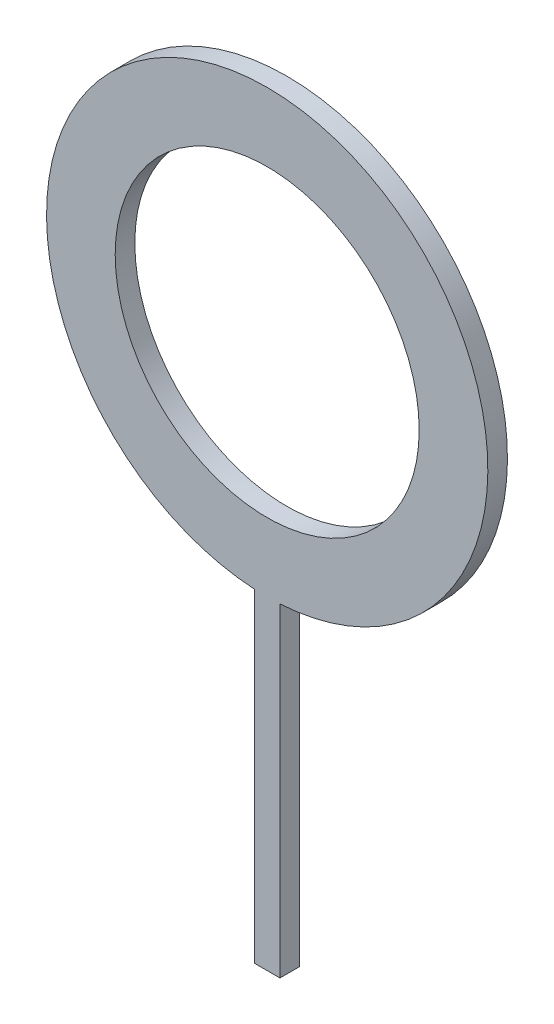
ISO-10303-21;
HEADER;
FILE_DESCRIPTION(('STEP AP214'),'2;1');
FILE_NAME('part.step','',(''),(''),'','','');
FILE_SCHEMA(('AUTOMOTIVE_DESIGN { 1 0 10303 214 1 1 1 1 }'));
ENDSEC;
DATA;
#1=APPLICATION_CONTEXT('core data for automotive mechanical design processes');
#2=APPLICATION_PROTOCOL_DEFINITION('international standard','automotive_design',2000,#1);
#3=PRODUCT_CONTEXT('',#1,'mechanical');
#4=PRODUCT('Part','Part','',(#3));
#5=PRODUCT_RELATED_PRODUCT_CATEGORY('part','',(#4));
#6=PRODUCT_DEFINITION_FORMATION('','',#4);
#7=PRODUCT_DEFINITION_CONTEXT('part definition',#1,'design');
#8=PRODUCT_DEFINITION('design','',#6,#7);
#9=PRODUCT_DEFINITION_SHAPE('','',#8);
#10=(LENGTH_UNIT() NAMED_UNIT(*) SI_UNIT(.MILLI.,.METRE.));
#11=(NAMED_UNIT(*) PLANE_ANGLE_UNIT() SI_UNIT($,.RADIAN.));
#12=(NAMED_UNIT(*) SI_UNIT($,.STERADIAN.) SOLID_ANGLE_UNIT());
#13=UNCERTAINTY_MEASURE_WITH_UNIT(LENGTH_MEASURE(1.E-05),#10,'distance_accuracy_value','');
#14=(GEOMETRIC_REPRESENTATION_CONTEXT(3) GLOBAL_UNCERTAINTY_ASSIGNED_CONTEXT((#13)) GLOBAL_UNIT_ASSIGNED_CONTEXT((#10,
#11,#12)) REPRESENTATION_CONTEXT('',''));
#15=CARTESIAN_POINT('',(0.,0.,0.));
#16=DIRECTION('',(0.,0.,1.));
#17=DIRECTION('',(1.,0.,0.));
#18=AXIS2_PLACEMENT_3D('',#15,#16,#17);
#19=CARTESIAN_POINT('',(0.,-27.75,1.));
#20=DIRECTION('',(0.,1.,0.));
#21=DIRECTION('',(0.,0.,1.));
#22=AXIS2_PLACEMENT_3D('',#19,#20,#21);
#23=PLANE('',#22);
#24=DIRECTION('',(1.,0.,0.));
#25=VECTOR('',#24,1.);
#26=CARTESIAN_POINT('',(0.,-27.75,0.));
#27=LINE('',#26,#25);
#28=CARTESIAN_POINT('',(-0.65,-27.75,0.));
#29=VERTEX_POINT('',#28);
#30=CARTESIAN_POINT('',(0.65,-27.75,0.));
#31=VERTEX_POINT('',#30);
#32=EDGE_CURVE('E102',#29,#31,#27,.T.);
#33=ORIENTED_EDGE('',*,*,#32,.T.);
#34=DIRECTION('',(0.,0.,-1.));
#35=VECTOR('',#34,1.);
#36=CARTESIAN_POINT('',(0.65,-27.75,1.));
#37=LINE('',#36,#35);
#38=CARTESIAN_POINT('',(0.65,-27.75,1.));
#39=VERTEX_POINT('',#38);
#40=EDGE_CURVE('E11',#39,#31,#37,.T.);
#41=ORIENTED_EDGE('',*,*,#40,.F.);
#42=DIRECTION('',(1.,0.,0.));
#43=VECTOR('',#42,1.);
#44=CARTESIAN_POINT('',(0.,-27.75,1.));
#45=LINE('',#44,#43);
#46=CARTESIAN_POINT('',(-0.65,-27.75,1.));
#47=VERTEX_POINT('',#46);
#48=EDGE_CURVE('E85',#47,#39,#45,.T.);
#49=ORIENTED_EDGE('',*,*,#48,.F.);
#50=DIRECTION('',(0.,0.,-1.));
#51=VECTOR('',#50,1.);
#52=CARTESIAN_POINT('',(-0.65,-27.75,1.));
#53=LINE('',#52,#51);
#54=EDGE_CURVE('E51',#47,#29,#53,.T.);
#55=ORIENTED_EDGE('',*,*,#54,.T.);
#56=EDGE_LOOP('',(#33,#41,#49,#55));
#57=FACE_BOUND('',#56,.T.);
#58=ADVANCED_FACE('F35',(#57),#23,.F.);
#59=CARTESIAN_POINT('',(0.650000000000001,0.,1.));
#60=DIRECTION('',(-1.,0.,0.));
#61=DIRECTION('',(0.,-1.,0.));
#62=AXIS2_PLACEMENT_3D('',#59,#60,#61);
#63=PLANE('',#62);
#64=DIRECTION('',(0.,1.,0.));
#65=VECTOR('',#64,1.);
#66=CARTESIAN_POINT('',(0.650000000000001,0.,0.));
#67=LINE('',#66,#65);
#68=CARTESIAN_POINT('',(0.650000000000001,-11.2312065246794,0.));
#69=VERTEX_POINT('',#68);
#70=EDGE_CURVE('E90',#31,#69,#67,.T.);
#71=ORIENTED_EDGE('',*,*,#70,.T.);
#72=DIRECTION('',(0.,0.,-1.));
#73=VECTOR('',#72,1.);
#74=CARTESIAN_POINT('',(0.650000000000001,-11.2312065246794,1.));
#75=LINE('',#74,#73);
#76=CARTESIAN_POINT('',(0.650000000000001,-11.2312065246794,1.));
#77=VERTEX_POINT('',#76);
#78=EDGE_CURVE('E43',#77,#69,#75,.T.);
#79=ORIENTED_EDGE('',*,*,#78,.F.);
#80=DIRECTION('',(0.,1.,0.));
#81=VECTOR('',#80,1.);
#82=CARTESIAN_POINT('',(0.650000000000001,0.,1.));
#83=LINE('',#82,#81);
#84=EDGE_CURVE('E77',#39,#77,#83,.T.);
#85=ORIENTED_EDGE('',*,*,#84,.F.);
#86=ORIENTED_EDGE('',*,*,#40,.T.);
#87=EDGE_LOOP('',(#71,#79,#85,#86));
#88=FACE_BOUND('',#87,.T.);
#89=ADVANCED_FACE('F89',(#88),#63,.F.);
#90=CARTESIAN_POINT('',(0.,0.,1.));
#91=DIRECTION('',(0.,0.,-1.));
#92=DIRECTION('',(-1.,0.,0.));
#93=AXIS2_PLACEMENT_3D('',#90,#91,#92);
#94=CYLINDRICAL_SURFACE('',#93,11.25);
#95=CARTESIAN_POINT('',(0.,0.,0.));
#96=DIRECTION('',(0.,0.,1.));
#97=DIRECTION('',(1.,0.,0.));
#98=AXIS2_PLACEMENT_3D('',#95,#96,#97);
#99=CIRCLE('',#98,11.25);
#100=CARTESIAN_POINT('',(-0.65,-11.2312065246794,0.));
#101=VERTEX_POINT('',#100);
#102=EDGE_CURVE('E105',#69,#101,#99,.T.);
#103=ORIENTED_EDGE('',*,*,#102,.T.);
#104=DIRECTION('',(0.,0.,-1.));
#105=VECTOR('',#104,1.);
#106=CARTESIAN_POINT('',(-0.65,-11.2312065246794,1.));
#107=LINE('',#106,#105);
#108=CARTESIAN_POINT('',(-0.65,-11.2312065246794,1.));
#109=VERTEX_POINT('',#108);
#110=EDGE_CURVE('E66',#109,#101,#107,.T.);
#111=ORIENTED_EDGE('',*,*,#110,.F.);
#112=CARTESIAN_POINT('',(0.,0.,1.));
#113=DIRECTION('',(0.,0.,1.));
#114=DIRECTION('',(1.,0.,0.));
#115=AXIS2_PLACEMENT_3D('',#112,#113,#114);
#116=CIRCLE('',#115,11.25);
#117=EDGE_CURVE('E84',#77,#109,#116,.T.);
#118=ORIENTED_EDGE('',*,*,#117,.F.);
#119=ORIENTED_EDGE('',*,*,#78,.T.);
#120=EDGE_LOOP('',(#103,#111,#118,#119));
#121=FACE_BOUND('',#120,.T.);
#122=ADVANCED_FACE('F93',(#121),#94,.T.);
#123=CARTESIAN_POINT('',(-0.65,0.,1.));
#124=DIRECTION('',(-1.,0.,0.));
#125=DIRECTION('',(0.,-1.,0.));
#126=AXIS2_PLACEMENT_3D('',#123,#124,#125);
#127=PLANE('',#126);
#128=DIRECTION('',(0.,1.,0.));
#129=VECTOR('',#128,1.);
#130=CARTESIAN_POINT('',(-0.65,0.,0.));
#131=LINE('',#130,#129);
#132=EDGE_CURVE('E107',#29,#101,#131,.T.);
#133=ORIENTED_EDGE('',*,*,#132,.F.);
#134=ORIENTED_EDGE('',*,*,#54,.F.);
#135=DIRECTION('',(0.,1.,0.));
#136=VECTOR('',#135,1.);
#137=CARTESIAN_POINT('',(-0.65,0.,1.));
#138=LINE('',#137,#136);
#139=EDGE_CURVE('E94',#47,#109,#138,.T.);
#140=ORIENTED_EDGE('',*,*,#139,.T.);
#141=ORIENTED_EDGE('',*,*,#110,.T.);
#142=EDGE_LOOP('',(#133,#134,#140,#141));
#143=FACE_BOUND('',#142,.T.);
#144=ADVANCED_FACE('F120',(#143),#127,.T.);
#145=CARTESIAN_POINT('',(0.,0.,1.));
#146=DIRECTION('',(0.,0.,-1.));
#147=DIRECTION('',(-1.,0.,0.));
#148=AXIS2_PLACEMENT_3D('',#145,#146,#147);
#149=CYLINDRICAL_SURFACE('',#148,7.75);
#150=CARTESIAN_POINT('',(0.,0.,1.));
#151=DIRECTION('',(0.,0.,1.));
#152=DIRECTION('',(1.,0.,0.));
#153=AXIS2_PLACEMENT_3D('',#150,#151,#152);
#154=CIRCLE('',#153,7.75);
#155=CARTESIAN_POINT('',(7.75,0.,1.));
#156=VERTEX_POINT('',#155);
#157=EDGE_CURVE('E96',#156,#156,#154,.T.);
#158=ORIENTED_EDGE('',*,*,#157,.T.);
#159=EDGE_LOOP('',(#158));
#160=FACE_BOUND('',#159,.T.);
#161=CARTESIAN_POINT('',(0.,0.,0.));
#162=DIRECTION('',(0.,0.,1.));
#163=DIRECTION('',(1.,0.,0.));
#164=AXIS2_PLACEMENT_3D('',#161,#162,#163);
#165=CIRCLE('',#164,7.75);
#166=CARTESIAN_POINT('',(7.75,0.,0.));
#167=VERTEX_POINT('',#166);
#168=EDGE_CURVE('E110',#167,#167,#165,.T.);
#169=ORIENTED_EDGE('',*,*,#168,.F.);
#170=EDGE_LOOP('',(#169));
#171=FACE_BOUND('',#170,.T.);
#172=ADVANCED_FACE('F118',(#160,#171),#149,.F.);
#173=CARTESIAN_POINT('',(0.,0.,1.));
#174=DIRECTION('',(0.,0.,1.));
#175=DIRECTION('',(1.,0.,0.));
#176=AXIS2_PLACEMENT_3D('',#173,#174,#175);
#177=PLANE('',#176);
#178=ORIENTED_EDGE('',*,*,#48,.T.);
#179=ORIENTED_EDGE('',*,*,#84,.T.);
#180=ORIENTED_EDGE('',*,*,#117,.T.);
#181=ORIENTED_EDGE('',*,*,#139,.F.);
#182=EDGE_LOOP('',(#178,#179,#180,#181));
#183=FACE_BOUND('',#182,.T.);
#184=ORIENTED_EDGE('',*,*,#157,.F.);
#185=EDGE_LOOP('',(#184));
#186=FACE_BOUND('',#185,.T.);
#187=ADVANCED_FACE('F80',(#183,#186),#177,.T.);
#188=CARTESIAN_POINT('',(0.,0.,0.));
#189=DIRECTION('',(0.,0.,1.));
#190=DIRECTION('',(1.,0.,0.));
#191=AXIS2_PLACEMENT_3D('',#188,#189,#190);
#192=PLANE('',#191);
#193=ORIENTED_EDGE('',*,*,#32,.F.);
#194=ORIENTED_EDGE('',*,*,#132,.T.);
#195=ORIENTED_EDGE('',*,*,#102,.F.);
#196=ORIENTED_EDGE('',*,*,#70,.F.);
#197=EDGE_LOOP('',(#193,#194,#195,#196));
#198=FACE_BOUND('',#197,.T.);
#199=ORIENTED_EDGE('',*,*,#168,.T.);
#200=EDGE_LOOP('',(#199));
#201=FACE_BOUND('',#200,.T.);
#202=ADVANCED_FACE('F116',(#198,#201),#192,.F.);
#203=CLOSED_SHELL('',(#58,#89,#122,#144,#172,#187,#202));
#204=MANIFOLD_SOLID_BREP('B2',#203);
#205=ADVANCED_BREP_SHAPE_REPRESENTATION('',(#18,#204),#14);
#206=SHAPE_DEFINITION_REPRESENTATION(#9,#205);
ENDSEC;
END-ISO-10303-21;
